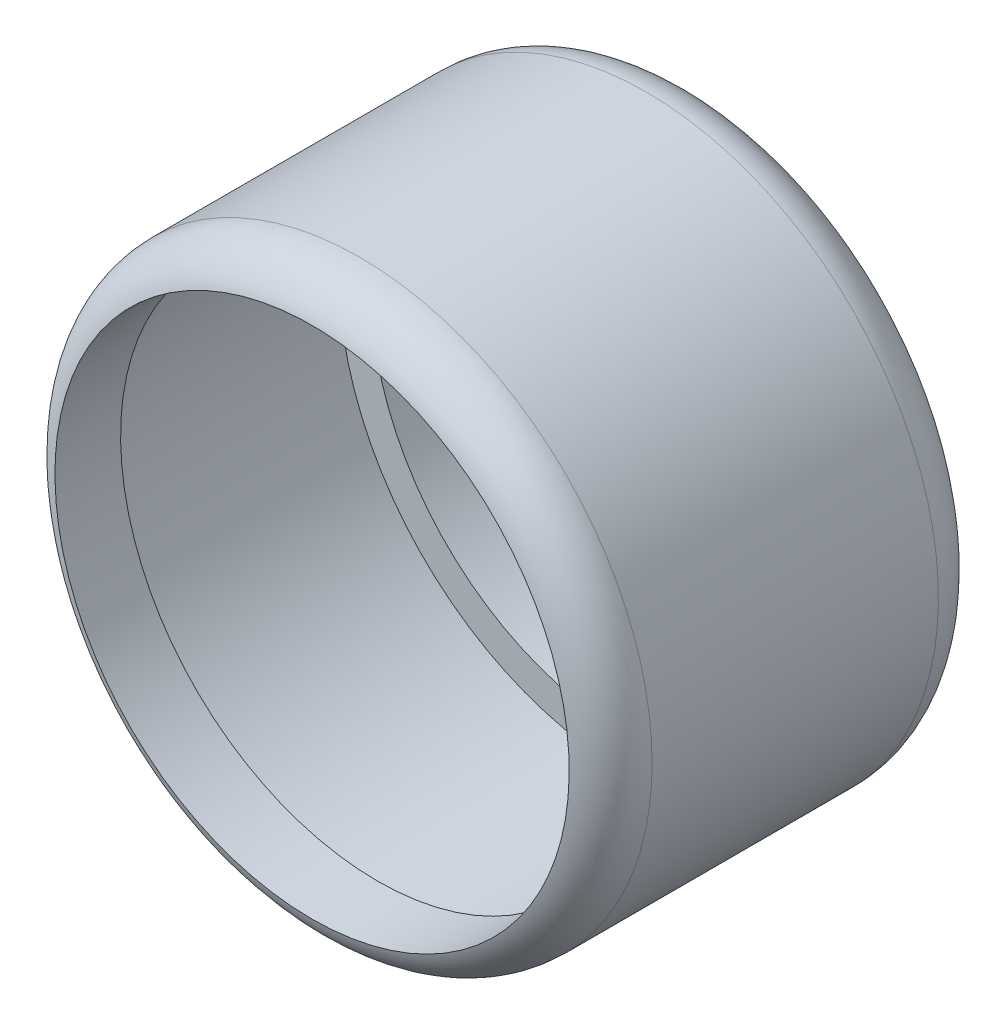
ISO-10303-21;
HEADER;
FILE_DESCRIPTION(('STEP AP214'),'2;1');
FILE_NAME('part.step','',(''),(''),'','','');
FILE_SCHEMA(('AUTOMOTIVE_DESIGN { 1 0 10303 214 1 1 1 1 }'));
ENDSEC;
DATA;
#1=APPLICATION_CONTEXT('core data for automotive mechanical design processes');
#2=APPLICATION_PROTOCOL_DEFINITION('international standard','automotive_design',2000,#1);
#3=PRODUCT_CONTEXT('',#1,'mechanical');
#4=PRODUCT('Part','Part','',(#3));
#5=PRODUCT_RELATED_PRODUCT_CATEGORY('part','',(#4));
#6=PRODUCT_DEFINITION_FORMATION('','',#4);
#7=PRODUCT_DEFINITION_CONTEXT('part definition',#1,'design');
#8=PRODUCT_DEFINITION('design','',#6,#7);
#9=PRODUCT_DEFINITION_SHAPE('','',#8);
#10=(LENGTH_UNIT() NAMED_UNIT(*) SI_UNIT(.MILLI.,.METRE.));
#11=(NAMED_UNIT(*) PLANE_ANGLE_UNIT() SI_UNIT($,.RADIAN.));
#12=(NAMED_UNIT(*) SI_UNIT($,.STERADIAN.) SOLID_ANGLE_UNIT());
#13=UNCERTAINTY_MEASURE_WITH_UNIT(LENGTH_MEASURE(1.E-05),#10,'distance_accuracy_value','');
#14=(GEOMETRIC_REPRESENTATION_CONTEXT(3) GLOBAL_UNCERTAINTY_ASSIGNED_CONTEXT((#13)) GLOBAL_UNIT_ASSIGNED_CONTEXT((#10,
#11,#12)) REPRESENTATION_CONTEXT('',''));
#15=CARTESIAN_POINT('',(0.,0.,0.));
#16=DIRECTION('',(0.,0.,1.));
#17=DIRECTION('',(1.,0.,0.));
#18=AXIS2_PLACEMENT_3D('',#15,#16,#17);
#19=CARTESIAN_POINT('',(0.,3.2250000000101,-8.77499999999971));
#20=DIRECTION('',(0.,1.19090534684255E-12,-1.));
#21=DIRECTION('',(0.,1.,1.19090534684255E-12));
#22=AXIS2_PLACEMENT_3D('',#19,#20,#21);
#23=CYLINDRICAL_SURFACE('',#22,25.4);
#24=CARTESIAN_POINT('',(0.,3.2250000000101,-8.77499999999971));
#25=DIRECTION('',(0.,1.19090534684255E-12,-1.));
#26=DIRECTION('',(0.,1.,1.19090534684255E-12));
#27=AXIS2_PLACEMENT_3D('',#24,#25,#26);
#28=CIRCLE('',#27,25.4);
#29=CARTESIAN_POINT('',(0.,28.6250000000101,-8.77499999996946));
#30=VERTEX_POINT('',#29);
#31=EDGE_CURVE('E11',#30,#30,#28,.T.);
#32=ORIENTED_EDGE('',*,*,#31,.T.);
#33=EDGE_LOOP('',(#32));
#34=FACE_BOUND('',#33,.T.);
#35=CARTESIAN_POINT('',(0.,3.22500000001129,-9.7749999999997));
#36=DIRECTION('',(0.,1.19090534684255E-12,-1.));
#37=DIRECTION('',(0.,1.,1.19090534684255E-12));
#38=AXIS2_PLACEMENT_3D('',#35,#36,#37);
#39=CIRCLE('',#38,25.4);
#40=CARTESIAN_POINT('',(0.,28.6250000000113,-9.77499999996946));
#41=VERTEX_POINT('',#40);
#42=EDGE_CURVE('E42',#41,#41,#39,.T.);
#43=ORIENTED_EDGE('',*,*,#42,.F.);
#44=EDGE_LOOP('',(#43));
#45=FACE_BOUND('',#44,.T.);
#46=ADVANCED_FACE('F39',(#34,#45),#23,.T.);
#47=CARTESIAN_POINT('',(0.,3.2250000000101,-8.77499999999971));
#48=DIRECTION('',(0.,1.19090534684255E-12,-1.));
#49=DIRECTION('',(0.,1.,1.19090534684255E-12));
#50=AXIS2_PLACEMENT_3D('',#47,#48,#49);
#51=PLANE('',#50);
#52=CARTESIAN_POINT('',(0.,3.2250000000101,-8.77499999999971));
#53=DIRECTION('',(0.,1.19090534684255E-12,-1.));
#54=DIRECTION('',(0.,1.,1.19090534684255E-12));
#55=AXIS2_PLACEMENT_3D('',#52,#53,#54);
#56=CIRCLE('',#55,24.9);
#57=CARTESIAN_POINT('',(0.,28.1250000000101,-8.77499999997005));
#58=VERTEX_POINT('',#57);
#59=EDGE_CURVE('E49',#58,#58,#56,.T.);
#60=ORIENTED_EDGE('',*,*,#59,.T.);
#61=EDGE_LOOP('',(#60));
#62=FACE_BOUND('',#61,.T.);
#63=ORIENTED_EDGE('',*,*,#31,.F.);
#64=EDGE_LOOP('',(#63));
#65=FACE_BOUND('',#64,.T.);
#66=ADVANCED_FACE('F57',(#62,#65),#51,.F.);
#67=CARTESIAN_POINT('',(0.,3.22500000001129,-9.7749999999997));
#68=DIRECTION('',(0.,1.19090534684255E-12,-1.));
#69=DIRECTION('',(0.,1.,1.19090534684255E-12));
#70=AXIS2_PLACEMENT_3D('',#67,#68,#69);
#71=PLANE('',#70);
#72=CARTESIAN_POINT('',(0.,3.22500000001129,-9.7749999999997));
#73=DIRECTION('',(0.,1.19090534684255E-12,-1.));
#74=DIRECTION('',(0.,1.,1.19090534684255E-12));
#75=AXIS2_PLACEMENT_3D('',#72,#73,#74);
#76=CIRCLE('',#75,24.9);
#77=CARTESIAN_POINT('',(0.,28.1250000000113,-9.77499999997005));
#78=VERTEX_POINT('',#77);
#79=EDGE_CURVE('E51',#78,#78,#76,.T.);
#80=ORIENTED_EDGE('',*,*,#79,.F.);
#81=EDGE_LOOP('',(#80));
#82=FACE_BOUND('',#81,.T.);
#83=ORIENTED_EDGE('',*,*,#42,.T.);
#84=EDGE_LOOP('',(#83));
#85=FACE_BOUND('',#84,.T.);
#86=ADVANCED_FACE('F63',(#82,#85),#71,.T.);
#87=CARTESIAN_POINT('',(0.,3.2250000000101,-8.77499999999971));
#88=DIRECTION('',(0.,1.19090534684255E-12,-1.));
#89=DIRECTION('',(0.,1.,1.19090534684255E-12));
#90=AXIS2_PLACEMENT_3D('',#87,#88,#89);
#91=CYLINDRICAL_SURFACE('',#90,24.9);
#92=ORIENTED_EDGE('',*,*,#59,.F.);
#93=EDGE_LOOP('',(#92));
#94=FACE_BOUND('',#93,.T.);
#95=ORIENTED_EDGE('',*,*,#79,.T.);
#96=EDGE_LOOP('',(#95));
#97=FACE_BOUND('',#96,.T.);
#98=ADVANCED_FACE('F60',(#94,#97),#91,.F.);
#99=CLOSED_SHELL('',(#46,#66,#86,#98));
#100=MANIFOLD_SOLID_BREP('B2',#99);
#101=CARTESIAN_POINT('',(0.,3.22499999997381,21.7750000000005));
#102=DIRECTION('',(0.,1.20487127219793E-12,-1.));
#103=DIRECTION('',(0.,1.,1.20487127219793E-12));
#104=AXIS2_PLACEMENT_3D('',#101,#102,#103);
#105=CYLINDRICAL_SURFACE('',#104,29.15);
#106=CARTESIAN_POINT('',(0.,3.22500000000608,-5.00530399291477));
#107=DIRECTION('',(0.,1.19788830952024E-12,-1.));
#108=DIRECTION('',(0.,1.,1.19788830952024E-12));
#109=AXIS2_PLACEMENT_3D('',#106,#107,#108);
#110=CIRCLE('',#109,29.15);
#111=CARTESIAN_POINT('',(0.,32.3750000000061,-5.00530399287985));
#112=VERTEX_POINT('',#111);
#113=EDGE_CURVE('E38',#112,#112,#110,.F.);
#114=ORIENTED_EDGE('',*,*,#113,.T.);
#115=EDGE_LOOP('',(#114));
#116=FACE_BOUND('',#115,.T.);
#117=CARTESIAN_POINT('',(0.,3.22499999997167,23.5553039929159));
#118=DIRECTION('',(0.,-1.19788830952024E-12,1.));
#119=DIRECTION('',(0.,-1.,-1.19788830952024E-12));
#120=AXIS2_PLACEMENT_3D('',#117,#118,#119);
#121=CIRCLE('',#120,29.15);
#122=CARTESIAN_POINT('',(0.,-25.9250000000283,23.555303992881));
#123=VERTEX_POINT('',#122);
#124=EDGE_CURVE('E108',#123,#123,#121,.F.);
#125=ORIENTED_EDGE('',*,*,#124,.T.);
#126=EDGE_LOOP('',(#125));
#127=FACE_BOUND('',#126,.T.);
#128=ADVANCED_FACE('F101',(#116,#127),#105,.T.);
#129=CARTESIAN_POINT('',(0.,3.22499999997381,21.7750000000005));
#130=DIRECTION('',(0.,1.20487127219793E-12,-1.));
#131=DIRECTION('',(0.,1.,1.20487127219793E-12));
#132=AXIS2_PLACEMENT_3D('',#129,#130,#131);
#133=CYLINDRICAL_SURFACE('',#132,28.9);
#134=CARTESIAN_POINT('',(0.,3.22499999997381,21.7750000000005));
#135=DIRECTION('',(0.,-1.20487127219793E-12,1.));
#136=DIRECTION('',(0.,-1.,-1.20487127219793E-12));
#137=AXIS2_PLACEMENT_3D('',#134,#135,#136);
#138=CIRCLE('',#137,28.9);
#139=CARTESIAN_POINT('',(0.,-25.6750000000262,21.7749999999656));
#140=VERTEX_POINT('',#139);
#141=EDGE_CURVE('E116',#140,#140,#138,.T.);
#142=ORIENTED_EDGE('',*,*,#141,.T.);
#143=EDGE_LOOP('',(#142));
#144=FACE_BOUND('',#143,.T.);
#145=CARTESIAN_POINT('',(0.,3.22500000000393,-3.22499999999953));
#146=DIRECTION('',(0.,-1.20487127219793E-12,1.));
#147=DIRECTION('',(0.,-1.,-1.20487127219793E-12));
#148=AXIS2_PLACEMENT_3D('',#145,#146,#147);
#149=CIRCLE('',#148,28.9);
#150=CARTESIAN_POINT('',(0.,-25.6749999999961,-3.22500000003435));
#151=VERTEX_POINT('',#150);
#152=EDGE_CURVE('E112',#151,#151,#149,.T.);
#153=ORIENTED_EDGE('',*,*,#152,.F.);
#154=EDGE_LOOP('',(#153));
#155=FACE_BOUND('',#154,.T.);
#156=ADVANCED_FACE('F149',(#144,#155),#133,.F.);
#157=CARTESIAN_POINT('',(0.,3.22499999997399,21.7750000000007));
#158=DIRECTION('',(0.,-1.19788830952024E-12,1.));
#159=DIRECTION('',(0.,-1.,-1.19788830952024E-12));
#160=AXIS2_PLACEMENT_3D('',#157,#158,#159);
#161=PLANE('',#160);
#162=CARTESIAN_POINT('',(0.,3.22499999997399,21.7750000000007));
#163=DIRECTION('',(0.,-1.19788830952024E-12,1.));
#164=DIRECTION('',(0.,-1.,-1.19788830952024E-12));
#165=AXIS2_PLACEMENT_3D('',#162,#163,#164);
#166=CIRCLE('',#165,25.65);
#167=CARTESIAN_POINT('',(0.,-22.425000000026,21.7749999999699));
#168=VERTEX_POINT('',#167);
#169=EDGE_CURVE('E122',#168,#168,#166,.T.);
#170=ORIENTED_EDGE('',*,*,#169,.T.);
#171=EDGE_LOOP('',(#170));
#172=FACE_BOUND('',#171,.T.);
#173=ORIENTED_EDGE('',*,*,#141,.F.);
#174=EDGE_LOOP('',(#173));
#175=FACE_BOUND('',#174,.T.);
#176=ADVANCED_FACE('F153',(#172,#175),#161,.F.);
#177=CARTESIAN_POINT('',(0.,3.22499999996614,28.3250000000007));
#178=DIRECTION('',(0.,1.19788830952024E-12,-1.));
#179=DIRECTION('',(0.,1.,1.19788830952024E-12));
#180=AXIS2_PLACEMENT_3D('',#177,#178,#179);
#181=CYLINDRICAL_SURFACE('',#180,25.65);
#182=CARTESIAN_POINT('',(0.,3.22499999996614,28.3250000000007));
#183=DIRECTION('',(0.,-1.19788830952024E-12,1.));
#184=DIRECTION('',(0.,-1.,-1.19788830952024E-12));
#185=AXIS2_PLACEMENT_3D('',#182,#183,#184);
#186=CIRCLE('',#185,25.65);
#187=CARTESIAN_POINT('',(0.,-22.4250000000339,28.3249999999699));
#188=VERTEX_POINT('',#187);
#189=EDGE_CURVE('E121',#188,#188,#186,.T.);
#190=ORIENTED_EDGE('',*,*,#189,.T.);
#191=EDGE_LOOP('',(#190));
#192=FACE_BOUND('',#191,.T.);
#193=ORIENTED_EDGE('',*,*,#169,.F.);
#194=EDGE_LOOP('',(#193));
#195=FACE_BOUND('',#194,.T.);
#196=ADVANCED_FACE('F159',(#192,#195),#181,.F.);
#197=CARTESIAN_POINT('',(0.,3.22500000000393,-3.22499999999953));
#198=DIRECTION('',(0.,1.19788830952024E-12,-1.));
#199=DIRECTION('',(0.,1.,1.19788830952024E-12));
#200=AXIS2_PLACEMENT_3D('',#197,#198,#199);
#201=PLANE('',#200);
#202=CARTESIAN_POINT('',(0.,3.22500000000393,-3.22499999999953));
#203=DIRECTION('',(0.,1.19788830952024E-12,-1.));
#204=DIRECTION('',(0.,1.,1.19788830952024E-12));
#205=AXIS2_PLACEMENT_3D('',#202,#203,#204);
#206=CIRCLE('',#205,25.65);
#207=CARTESIAN_POINT('',(0.,28.8750000000039,-3.22499999996881));
#208=VERTEX_POINT('',#207);
#209=EDGE_CURVE('E128',#208,#208,#206,.T.);
#210=ORIENTED_EDGE('',*,*,#209,.T.);
#211=EDGE_LOOP('',(#210));
#212=FACE_BOUND('',#211,.T.);
#213=ORIENTED_EDGE('',*,*,#152,.T.);
#214=EDGE_LOOP('',(#213));
#215=FACE_BOUND('',#214,.T.);
#216=ADVANCED_FACE('F145',(#212,#215),#201,.F.);
#217=CARTESIAN_POINT('',(0.,3.22500000001178,-9.77499999999953));
#218=DIRECTION('',(0.,-1.19788830952024E-12,1.));
#219=DIRECTION('',(0.,-1.,-1.19788830952024E-12));
#220=AXIS2_PLACEMENT_3D('',#217,#218,#219);
#221=CYLINDRICAL_SURFACE('',#220,25.65);
#222=CARTESIAN_POINT('',(0.,3.22500000001178,-9.77499999999953));
#223=DIRECTION('',(0.,1.19788830952024E-12,-1.));
#224=DIRECTION('',(0.,1.,1.19788830952024E-12));
#225=AXIS2_PLACEMENT_3D('',#222,#223,#224);
#226=CIRCLE('',#225,25.65);
#227=CARTESIAN_POINT('',(0.,28.8750000000118,-9.77499999996881));
#228=VERTEX_POINT('',#227);
#229=EDGE_CURVE('E125',#228,#228,#226,.T.);
#230=ORIENTED_EDGE('',*,*,#229,.T.);
#231=EDGE_LOOP('',(#230));
#232=FACE_BOUND('',#231,.T.);
#233=ORIENTED_EDGE('',*,*,#209,.F.);
#234=EDGE_LOOP('',(#233));
#235=FACE_BOUND('',#234,.T.);
#236=ADVANCED_FACE('F134',(#232,#235),#221,.F.);
#237=CARTESIAN_POINT('',(0.,3.22500000000607,-5.00530399291481));
#238=DIRECTION('',(0.,1.19788830952024E-12,-1.));
#239=DIRECTION('',(0.,1.,1.19788830952024E-12));
#240=AXIS2_PLACEMENT_3D('',#237,#238,#239);
#241=TOROIDAL_SURFACE('',#240,24.15,5.);
#242=ORIENTED_EDGE('',*,*,#113,.F.);
#243=EDGE_LOOP('',(#242));
#244=FACE_BOUND('',#243,.T.);
#245=ORIENTED_EDGE('',*,*,#229,.F.);
#246=EDGE_LOOP('',(#245));
#247=FACE_BOUND('',#246,.T.);
#248=ADVANCED_FACE('F137',(#244,#247),#241,.T.);
#249=CARTESIAN_POINT('',(0.,3.22499999997186,23.5553039929159));
#250=DIRECTION('',(0.,-1.19788830952024E-12,1.));
#251=DIRECTION('',(0.,-1.,-1.19788830952024E-12));
#252=AXIS2_PLACEMENT_3D('',#249,#250,#251);
#253=TOROIDAL_SURFACE('',#252,24.15,5.);
#254=ORIENTED_EDGE('',*,*,#124,.F.);
#255=EDGE_LOOP('',(#254));
#256=FACE_BOUND('',#255,.T.);
#257=ORIENTED_EDGE('',*,*,#189,.F.);
#258=EDGE_LOOP('',(#257));
#259=FACE_BOUND('',#258,.T.);
#260=ADVANCED_FACE('F103',(#256,#259),#253,.T.);
#261=CLOSED_SHELL('',(#128,#156,#176,#196,#216,#236,#248,#260));
#262=MANIFOLD_SOLID_BREP('B6',#261);
#263=ADVANCED_BREP_SHAPE_REPRESENTATION('',(#18,#100,#262),#14);
#264=SHAPE_DEFINITION_REPRESENTATION(#9,#263);
ENDSEC;
END-ISO-10303-21;
